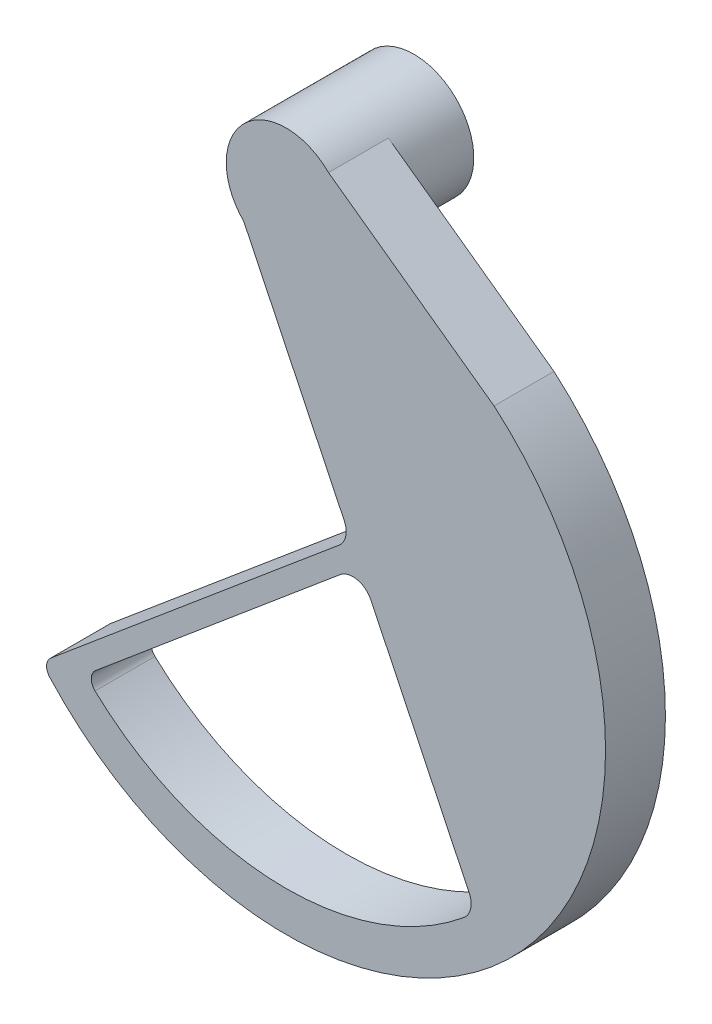
ISO-10303-21;
HEADER;
FILE_DESCRIPTION(('STEP AP214'),'2;1');
FILE_NAME('part.step','',(''),(''),'','','');
FILE_SCHEMA(('AUTOMOTIVE_DESIGN { 1 0 10303 214 1 1 1 1 }'));
ENDSEC;
DATA;
#1=APPLICATION_CONTEXT('core data for automotive mechanical design processes');
#2=APPLICATION_PROTOCOL_DEFINITION('international standard','automotive_design',2000,#1);
#3=PRODUCT_CONTEXT('',#1,'mechanical');
#4=PRODUCT('Part','Part','',(#3));
#5=PRODUCT_RELATED_PRODUCT_CATEGORY('part','',(#4));
#6=PRODUCT_DEFINITION_FORMATION('','',#4);
#7=PRODUCT_DEFINITION_CONTEXT('part definition',#1,'design');
#8=PRODUCT_DEFINITION('design','',#6,#7);
#9=PRODUCT_DEFINITION_SHAPE('','',#8);
#10=(LENGTH_UNIT() NAMED_UNIT(*) SI_UNIT(.MILLI.,.METRE.));
#11=(NAMED_UNIT(*) PLANE_ANGLE_UNIT() SI_UNIT($,.RADIAN.));
#12=(NAMED_UNIT(*) SI_UNIT($,.STERADIAN.) SOLID_ANGLE_UNIT());
#13=UNCERTAINTY_MEASURE_WITH_UNIT(LENGTH_MEASURE(1.E-05),#10,'distance_accuracy_value','');
#14=(GEOMETRIC_REPRESENTATION_CONTEXT(3) GLOBAL_UNCERTAINTY_ASSIGNED_CONTEXT((#13)) GLOBAL_UNIT_ASSIGNED_CONTEXT((#10,
#11,#12)) REPRESENTATION_CONTEXT('',''));
#15=CARTESIAN_POINT('',(0.,0.,0.));
#16=DIRECTION('',(0.,0.,1.));
#17=DIRECTION('',(1.,0.,0.));
#18=AXIS2_PLACEMENT_3D('',#15,#16,#17);
#19=CARTESIAN_POINT('',(0.,0.,0.));
#20=DIRECTION('',(0.,0.,1.));
#21=DIRECTION('',(1.,0.,0.));
#22=AXIS2_PLACEMENT_3D('',#19,#20,#21);
#23=PLANE('',#22);
#24=DIRECTION('',(0.433389731511241,-0.901206602628173,0.));
#25=VECTOR('',#24,1.);
#26=CARTESIAN_POINT('',(-12.7570586950624,-6.1348621133076,0.));
#27=LINE('',#26,#25);
#28=CARTESIAN_POINT('',(21.2324006956412,-76.8137984043253,0.));
#29=VERTEX_POINT('',#28);
#30=CARTESIAN_POINT('',(45.844843506453,-127.9938203457,0.));
#31=VERTEX_POINT('',#30);
#32=EDGE_CURVE('E182',#29,#31,#27,.T.);
#33=ORIENTED_EDGE('',*,*,#32,.F.);
#34=CARTESIAN_POINT('',(16.7263676825004,-78.9807470618814,0.));
#35=DIRECTION('',(0.,0.,1.));
#36=DIRECTION('',(1.,0.,0.));
#37=AXIS2_PLACEMENT_3D('',#34,#35,#36);
#38=CIRCLE('',#37,5.);
#39=CARTESIAN_POINT('',(13.5112294647628,-75.1515322284145,0.));
#40=VERTEX_POINT('',#39);
#41=EDGE_CURVE('E106',#40,#29,#38,.F.);
#42=ORIENTED_EDGE('',*,*,#41,.F.);
#43=DIRECTION('',(0.765842966693394,0.643027643547508,0.));
#44=VECTOR('',#43,1.);
#45=CARTESIAN_POINT('',(42.5956727933285,-50.7312504333006,0.));
#46=LINE('',#45,#44);
#47=CARTESIAN_POINT('',(-47.7476784165524,-126.586582094174,0.));
#48=VERTEX_POINT('',#47);
#49=EDGE_CURVE('E100',#48,#40,#46,.T.);
#50=ORIENTED_EDGE('',*,*,#49,.F.);
#51=CARTESIAN_POINT('',(-45.8185954859101,-128.884110994254,0.));
#52=DIRECTION('',(0.,0.,1.));
#53=DIRECTION('',(1.,0.,0.));
#54=AXIS2_PLACEMENT_3D('',#51,#52,#53);
#55=CIRCLE('',#54,2.99999999999979);
#56=CARTESIAN_POINT('',(-47.870174388264,-131.072951785042,0.));
#57=VERTEX_POINT('',#56);
#58=EDGE_CURVE('E158',#57,#48,#55,.F.);
#59=ORIENTED_EDGE('',*,*,#58,.F.);
#60=CARTESIAN_POINT('',(0.,-80.,0.));
#61=DIRECTION('',(0.,0.,1.));
#62=DIRECTION('',(1.,0.,0.));
#63=AXIS2_PLACEMENT_3D('',#60,#61,#62);
#64=CIRCLE('',#63,70.);
#65=CARTESIAN_POINT('',(44.5187189927976,-134.019289695814,0.));
#66=VERTEX_POINT('',#65);
#67=EDGE_CURVE('E189',#57,#66,#64,.T.);
#68=ORIENTED_EDGE('',*,*,#67,.T.);
#69=CARTESIAN_POINT('',(41.3388104933121,-130.160769003256,0.));
#70=DIRECTION('',(0.,0.,1.));
#71=DIRECTION('',(1.,0.,0.));
#72=AXIS2_PLACEMENT_3D('',#69,#70,#71);
#73=CIRCLE('',#72,4.99999999999999);
#74=EDGE_CURVE('E185',#31,#66,#73,.F.);
#75=ORIENTED_EDGE('',*,*,#74,.F.);
#76=EDGE_LOOP('',(#33,#42,#50,#59,#68,#75));
#77=FACE_BOUND('',#76,.T.);
#78=CARTESIAN_POINT('',(0.,0.,0.));
#79=DIRECTION('',(0.,0.,-1.));
#80=DIRECTION('',(-1.,0.,0.));
#81=AXIS2_PLACEMENT_3D('',#78,#79,#80);
#82=CIRCLE('',#81,15.);
#83=CARTESIAN_POINT('',(10.6066017177981,10.6066017177983,0.));
#84=VERTEX_POINT('',#83);
#85=CARTESIAN_POINT('',(-10.6066017177981,-10.6066017177983,0.));
#86=VERTEX_POINT('',#85);
#87=EDGE_CURVE('E215',#84,#86,#82,.T.);
#88=ORIENTED_EDGE('',*,*,#87,.F.);
#89=DIRECTION('',(0.811357931424902,-0.584549661802916,0.));
#90=VECTOR('',#89,1.);
#91=CARTESIAN_POINT('',(8.65474635415258,12.0128323695447,0.));
#92=LINE('',#91,#90);
#93=CARTESIAN_POINT('',(52.0761789176771,-19.2705047828151,0.));
#94=VERTEX_POINT('',#93);
#95=EDGE_CURVE('E181',#84,#94,#92,.T.);
#96=ORIENTED_EDGE('',*,*,#95,.T.);
#97=CARTESIAN_POINT('',(0.,-80.,0.));
#98=DIRECTION('',(0.,0.,1.));
#99=DIRECTION('',(1.,0.,0.));
#100=AXIS2_PLACEMENT_3D('',#97,#98,#99);
#101=CIRCLE('',#100,80.);
#102=CARTESIAN_POINT('',(-59.2335308651964,-133.771635843089,0.));
#103=VERTEX_POINT('',#102);
#104=EDGE_CURVE('E178',#103,#94,#101,.T.);
#105=ORIENTED_EDGE('',*,*,#104,.F.);
#106=CARTESIAN_POINT('',(-57.0122734577518,-131.755199498973,0.));
#107=DIRECTION('',(0.,0.,1.));
#108=DIRECTION('',(1.,0.,0.));
#109=AXIS2_PLACEMENT_3D('',#106,#107,#108);
#110=CIRCLE('',#109,2.99999999999976);
#111=CARTESIAN_POINT('',(-58.9406362868111,-129.457066169617,0.));
#112=VERTEX_POINT('',#111);
#113=EDGE_CURVE('E175',#103,#112,#110,.F.);
#114=ORIENTED_EDGE('',*,*,#113,.T.);
#115=DIRECTION('',(0.766044443118982,0.642787609686534,0.));
#116=VECTOR('',#115,1.);
#117=CARTESIAN_POINT('',(39.3923101204882,-46.9459271066778,0.));
#118=LINE('',#117,#116);
#119=CARTESIAN_POINT('',(13.2441851892925,-68.8868090924212,0.));
#120=VERTEX_POINT('',#119);
#121=EDGE_CURVE('E171',#112,#120,#118,.T.);
#122=ORIENTED_EDGE('',*,*,#121,.T.);
#123=CARTESIAN_POINT('',(10.0302471408598,-65.0565868768263,0.));
#124=DIRECTION('',(0.,0.,1.));
#125=DIRECTION('',(1.,0.,0.));
#126=AXIS2_PLACEMENT_3D('',#123,#124,#125);
#127=CIRCLE('',#126,5.);
#128=CARTESIAN_POINT('',(14.5362801540007,-62.8896382192701,0.));
#129=VERTEX_POINT('',#128);
#130=EDGE_CURVE('E168',#120,#129,#127,.T.);
#131=ORIENTED_EDGE('',*,*,#130,.T.);
#132=DIRECTION('',(0.433389731511242,-0.901206602628173,0.));
#133=VECTOR('',#132,1.);
#134=CARTESIAN_POINT('',(-12.7570586950624,-6.13486211330761,0.));
#135=LINE('',#134,#133);
#136=EDGE_CURVE('E186',#86,#129,#135,.T.);
#137=ORIENTED_EDGE('',*,*,#136,.F.);
#138=EDGE_LOOP('',(#88,#96,#105,#114,#122,#131,#137));
#139=FACE_BOUND('',#138,.T.);
#140=ADVANCED_FACE('F39',(#77,#139),#23,.F.);
#141=CARTESIAN_POINT('',(-12.7570586950624,-6.1348621133076,15.));
#142=DIRECTION('',(0.901206602628173,0.433389731511241,0.));
#143=DIRECTION('',(-0.433389731511241,0.901206602628173,0.));
#144=AXIS2_PLACEMENT_3D('',#141,#142,#143);
#145=PLANE('',#144);
#146=ORIENTED_EDGE('',*,*,#32,.T.);
#147=DIRECTION('',(0.,0.,-1.));
#148=VECTOR('',#147,1.);
#149=CARTESIAN_POINT('',(45.844843506453,-127.9938203457,15.));
#150=LINE('',#149,#148);
#151=CARTESIAN_POINT('',(45.844843506453,-127.9938203457,15.));
#152=VERTEX_POINT('',#151);
#153=EDGE_CURVE('E11',#152,#31,#150,.T.);
#154=ORIENTED_EDGE('',*,*,#153,.F.);
#155=DIRECTION('',(0.433389731511241,-0.901206602628173,0.));
#156=VECTOR('',#155,1.);
#157=CARTESIAN_POINT('',(-12.7570586950624,-6.1348621133076,15.));
#158=LINE('',#157,#156);
#159=CARTESIAN_POINT('',(21.2324006956412,-76.8137984043253,15.));
#160=VERTEX_POINT('',#159);
#161=EDGE_CURVE('E236',#160,#152,#158,.T.);
#162=ORIENTED_EDGE('',*,*,#161,.F.);
#163=DIRECTION('',(0.,0.,-1.));
#164=VECTOR('',#163,1.);
#165=CARTESIAN_POINT('',(21.2324006956412,-76.8137984043253,15.));
#166=LINE('',#165,#164);
#167=EDGE_CURVE('E196',#160,#29,#166,.T.);
#168=ORIENTED_EDGE('',*,*,#167,.T.);
#169=EDGE_LOOP('',(#146,#154,#162,#168));
#170=FACE_BOUND('',#169,.T.);
#171=ADVANCED_FACE('F248',(#170),#145,.F.);
#172=CARTESIAN_POINT('',(41.3388104933121,-130.160769003256,15.));
#173=DIRECTION('',(0.,0.,-1.));
#174=DIRECTION('',(-1.,0.,0.));
#175=AXIS2_PLACEMENT_3D('',#172,#173,#174);
#176=CYLINDRICAL_SURFACE('',#175,4.99999999999999);
#177=ORIENTED_EDGE('',*,*,#74,.T.);
#178=DIRECTION('',(0.,0.,-1.));
#179=VECTOR('',#178,1.);
#180=CARTESIAN_POINT('',(44.5187189927976,-134.019289695814,15.));
#181=LINE('',#180,#179);
#182=CARTESIAN_POINT('',(44.5187189927976,-134.019289695814,15.));
#183=VERTEX_POINT('',#182);
#184=EDGE_CURVE('E49',#183,#66,#181,.T.);
#185=ORIENTED_EDGE('',*,*,#184,.F.);
#186=CARTESIAN_POINT('',(41.3388104933121,-130.160769003256,15.));
#187=DIRECTION('',(0.,0.,1.));
#188=DIRECTION('',(1.,0.,0.));
#189=AXIS2_PLACEMENT_3D('',#186,#187,#188);
#190=CIRCLE('',#189,4.99999999999999);
#191=EDGE_CURVE('E238',#152,#183,#190,.F.);
#192=ORIENTED_EDGE('',*,*,#191,.F.);
#193=ORIENTED_EDGE('',*,*,#153,.T.);
#194=EDGE_LOOP('',(#177,#185,#192,#193));
#195=FACE_BOUND('',#194,.T.);
#196=ADVANCED_FACE('F270',(#195),#176,.F.);
#197=CARTESIAN_POINT('',(0.,-80.,15.));
#198=DIRECTION('',(0.,0.,-1.));
#199=DIRECTION('',(-1.,0.,0.));
#200=AXIS2_PLACEMENT_3D('',#197,#198,#199);
#201=CYLINDRICAL_SURFACE('',#200,70.);
#202=ORIENTED_EDGE('',*,*,#67,.F.);
#203=DIRECTION('',(0.,0.,-1.));
#204=VECTOR('',#203,1.);
#205=CARTESIAN_POINT('',(-47.870174388264,-131.072951785042,15.));
#206=LINE('',#205,#204);
#207=CARTESIAN_POINT('',(-47.870174388264,-131.072951785042,15.));
#208=VERTEX_POINT('',#207);
#209=EDGE_CURVE('E159',#208,#57,#206,.T.);
#210=ORIENTED_EDGE('',*,*,#209,.F.);
#211=CARTESIAN_POINT('',(0.,-80.,15.));
#212=DIRECTION('',(0.,0.,1.));
#213=DIRECTION('',(1.,0.,0.));
#214=AXIS2_PLACEMENT_3D('',#211,#212,#213);
#215=CIRCLE('',#214,70.);
#216=EDGE_CURVE('E152',#208,#183,#215,.T.);
#217=ORIENTED_EDGE('',*,*,#216,.T.);
#218=ORIENTED_EDGE('',*,*,#184,.T.);
#219=EDGE_LOOP('',(#202,#210,#217,#218));
#220=FACE_BOUND('',#219,.T.);
#221=ADVANCED_FACE('F241',(#220),#201,.F.);
#222=CARTESIAN_POINT('',(-45.8185954859101,-128.884110994254,15.));
#223=DIRECTION('',(0.,0.,-1.));
#224=DIRECTION('',(-1.,0.,0.));
#225=AXIS2_PLACEMENT_3D('',#222,#223,#224);
#226=CYLINDRICAL_SURFACE('',#225,2.99999999999979);
#227=ORIENTED_EDGE('',*,*,#58,.T.);
#228=DIRECTION('',(0.,0.,-1.));
#229=VECTOR('',#228,1.);
#230=CARTESIAN_POINT('',(-47.7476784165524,-126.586582094174,15.));
#231=LINE('',#230,#229);
#232=CARTESIAN_POINT('',(-47.7476784165524,-126.586582094174,15.));
#233=VERTEX_POINT('',#232);
#234=EDGE_CURVE('E155',#233,#48,#231,.T.);
#235=ORIENTED_EDGE('',*,*,#234,.F.);
#236=CARTESIAN_POINT('',(-45.8185954859101,-128.884110994254,15.));
#237=DIRECTION('',(0.,0.,1.));
#238=DIRECTION('',(1.,0.,0.));
#239=AXIS2_PLACEMENT_3D('',#236,#237,#238);
#240=CIRCLE('',#239,2.99999999999979);
#241=EDGE_CURVE('E146',#208,#233,#240,.F.);
#242=ORIENTED_EDGE('',*,*,#241,.F.);
#243=ORIENTED_EDGE('',*,*,#209,.T.);
#244=EDGE_LOOP('',(#227,#235,#242,#243));
#245=FACE_BOUND('',#244,.T.);
#246=ADVANCED_FACE('F156',(#245),#226,.F.);
#247=CARTESIAN_POINT('',(42.5956727933285,-50.7312504333006,15.));
#248=DIRECTION('',(-0.643027643547508,0.765842966693394,0.));
#249=DIRECTION('',(-0.765842966693394,-0.643027643547508,0.));
#250=AXIS2_PLACEMENT_3D('',#247,#248,#249);
#251=PLANE('',#250);
#252=ORIENTED_EDGE('',*,*,#49,.T.);
#253=DIRECTION('',(0.,0.,-1.));
#254=VECTOR('',#253,1.);
#255=CARTESIAN_POINT('',(13.5112294647628,-75.1515322284145,15.));
#256=LINE('',#255,#254);
#257=CARTESIAN_POINT('',(13.5112294647628,-75.1515322284145,15.));
#258=VERTEX_POINT('',#257);
#259=EDGE_CURVE('E160',#258,#40,#256,.T.);
#260=ORIENTED_EDGE('',*,*,#259,.F.);
#261=DIRECTION('',(0.765842966693394,0.643027643547508,0.));
#262=VECTOR('',#261,1.);
#263=CARTESIAN_POINT('',(42.5956727933285,-50.7312504333006,15.));
#264=LINE('',#263,#262);
#265=EDGE_CURVE('E150',#233,#258,#264,.T.);
#266=ORIENTED_EDGE('',*,*,#265,.F.);
#267=ORIENTED_EDGE('',*,*,#234,.T.);
#268=EDGE_LOOP('',(#252,#260,#266,#267));
#269=FACE_BOUND('',#268,.T.);
#270=ADVANCED_FACE('F162',(#269),#251,.F.);
#271=CARTESIAN_POINT('',(10.0302471408598,-65.0565868768263,15.));
#272=DIRECTION('',(0.,0.,-1.));
#273=DIRECTION('',(-1.,0.,0.));
#274=AXIS2_PLACEMENT_3D('',#271,#272,#273);
#275=CYLINDRICAL_SURFACE('',#274,5.);
#276=ORIENTED_EDGE('',*,*,#130,.F.);
#277=DIRECTION('',(0.,0.,-1.));
#278=VECTOR('',#277,1.);
#279=CARTESIAN_POINT('',(13.2441851892925,-68.8868090924212,15.));
#280=LINE('',#279,#278);
#281=CARTESIAN_POINT('',(13.2441851892925,-68.8868090924212,15.));
#282=VERTEX_POINT('',#281);
#283=EDGE_CURVE('E114',#282,#120,#280,.T.);
#284=ORIENTED_EDGE('',*,*,#283,.F.);
#285=CARTESIAN_POINT('',(10.0302471408598,-65.0565868768263,15.));
#286=DIRECTION('',(0.,0.,1.));
#287=DIRECTION('',(1.,0.,0.));
#288=AXIS2_PLACEMENT_3D('',#285,#286,#287);
#289=CIRCLE('',#288,5.);
#290=CARTESIAN_POINT('',(14.5362801540007,-62.8896382192701,15.));
#291=VERTEX_POINT('',#290);
#292=EDGE_CURVE('E195',#282,#291,#289,.T.);
#293=ORIENTED_EDGE('',*,*,#292,.T.);
#294=DIRECTION('',(0.,0.,-1.));
#295=VECTOR('',#294,1.);
#296=CARTESIAN_POINT('',(14.5362801540007,-62.8896382192701,15.));
#297=LINE('',#296,#295);
#298=EDGE_CURVE('E164',#291,#129,#297,.T.);
#299=ORIENTED_EDGE('',*,*,#298,.T.);
#300=EDGE_LOOP('',(#276,#284,#293,#299));
#301=FACE_BOUND('',#300,.T.);
#302=ADVANCED_FACE('F41',(#301),#275,.F.);
#303=CARTESIAN_POINT('',(39.3923101204882,-46.9459271066778,15.));
#304=DIRECTION('',(-0.642787609686534,0.766044443118983,0.));
#305=DIRECTION('',(-0.766044443118982,-0.642787609686534,0.));
#306=AXIS2_PLACEMENT_3D('',#303,#304,#305);
#307=PLANE('',#306);
#308=ORIENTED_EDGE('',*,*,#121,.F.);
#309=DIRECTION('',(0.,0.,-1.));
#310=VECTOR('',#309,1.);
#311=CARTESIAN_POINT('',(-58.9406362868111,-129.457066169617,15.));
#312=LINE('',#311,#310);
#313=CARTESIAN_POINT('',(-58.9406362868111,-129.457066169617,15.));
#314=VERTEX_POINT('',#313);
#315=EDGE_CURVE('E208',#314,#112,#312,.T.);
#316=ORIENTED_EDGE('',*,*,#315,.F.);
#317=DIRECTION('',(0.766044443118982,0.642787609686534,0.));
#318=VECTOR('',#317,1.);
#319=CARTESIAN_POINT('',(39.3923101204882,-46.9459271066778,15.));
#320=LINE('',#319,#318);
#321=EDGE_CURVE('E221',#314,#282,#320,.T.);
#322=ORIENTED_EDGE('',*,*,#321,.T.);
#323=ORIENTED_EDGE('',*,*,#283,.T.);
#324=EDGE_LOOP('',(#308,#316,#322,#323));
#325=FACE_BOUND('',#324,.T.);
#326=ADVANCED_FACE('F313',(#325),#307,.T.);
#327=CARTESIAN_POINT('',(-57.0122734577518,-131.755199498973,15.));
#328=DIRECTION('',(0.,0.,-1.));
#329=DIRECTION('',(-1.,0.,0.));
#330=AXIS2_PLACEMENT_3D('',#327,#328,#329);
#331=CYLINDRICAL_SURFACE('',#330,2.99999999999976);
#332=ORIENTED_EDGE('',*,*,#113,.F.);
#333=DIRECTION('',(0.,0.,-1.));
#334=VECTOR('',#333,1.);
#335=CARTESIAN_POINT('',(-59.2335308651964,-133.771635843089,15.));
#336=LINE('',#335,#334);
#337=CARTESIAN_POINT('',(-59.2335308651964,-133.771635843089,15.));
#338=VERTEX_POINT('',#337);
#339=EDGE_CURVE('E205',#338,#103,#336,.T.);
#340=ORIENTED_EDGE('',*,*,#339,.F.);
#341=CARTESIAN_POINT('',(-57.0122734577518,-131.755199498973,15.));
#342=DIRECTION('',(0.,0.,1.));
#343=DIRECTION('',(1.,0.,0.));
#344=AXIS2_PLACEMENT_3D('',#341,#342,#343);
#345=CIRCLE('',#344,2.99999999999976);
#346=EDGE_CURVE('E224',#338,#314,#345,.F.);
#347=ORIENTED_EDGE('',*,*,#346,.T.);
#348=ORIENTED_EDGE('',*,*,#315,.T.);
#349=EDGE_LOOP('',(#332,#340,#347,#348));
#350=FACE_BOUND('',#349,.T.);
#351=ADVANCED_FACE('F310',(#350),#331,.T.);
#352=CARTESIAN_POINT('',(0.,-80.,15.));
#353=DIRECTION('',(0.,0.,-1.));
#354=DIRECTION('',(-1.,0.,0.));
#355=AXIS2_PLACEMENT_3D('',#352,#353,#354);
#356=CYLINDRICAL_SURFACE('',#355,80.);
#357=ORIENTED_EDGE('',*,*,#104,.T.);
#358=DIRECTION('',(0.,0.,-1.));
#359=VECTOR('',#358,1.);
#360=CARTESIAN_POINT('',(52.0761789176771,-19.2705047828151,15.));
#361=LINE('',#360,#359);
#362=CARTESIAN_POINT('',(52.0761789176771,-19.2705047828151,15.));
#363=VERTEX_POINT('',#362);
#364=EDGE_CURVE('E203',#363,#94,#361,.T.);
#365=ORIENTED_EDGE('',*,*,#364,.F.);
#366=CARTESIAN_POINT('',(0.,-80.,15.));
#367=DIRECTION('',(0.,0.,1.));
#368=DIRECTION('',(1.,0.,0.));
#369=AXIS2_PLACEMENT_3D('',#366,#367,#368);
#370=CIRCLE('',#369,80.);
#371=EDGE_CURVE('E227',#338,#363,#370,.T.);
#372=ORIENTED_EDGE('',*,*,#371,.F.);
#373=ORIENTED_EDGE('',*,*,#339,.T.);
#374=EDGE_LOOP('',(#357,#365,#372,#373));
#375=FACE_BOUND('',#374,.T.);
#376=ADVANCED_FACE('F303',(#375),#356,.T.);
#377=CARTESIAN_POINT('',(8.65474635415258,12.0128323695447,15.));
#378=DIRECTION('',(0.584549661802916,0.811357931424902,0.));
#379=DIRECTION('',(-0.811357931424902,0.584549661802916,0.));
#380=AXIS2_PLACEMENT_3D('',#377,#378,#379);
#381=PLANE('',#380);
#382=ORIENTED_EDGE('',*,*,#95,.F.);
#383=DIRECTION('',(0.,0.,-1.));
#384=VECTOR('',#383,1.);
#385=CARTESIAN_POINT('',(10.6066017177981,10.6066017177983,15.));
#386=LINE('',#385,#384);
#387=CARTESIAN_POINT('',(10.6066017177981,10.6066017177983,15.));
#388=VERTEX_POINT('',#387);
#389=EDGE_CURVE('E206',#388,#84,#386,.T.);
#390=ORIENTED_EDGE('',*,*,#389,.F.);
#391=DIRECTION('',(0.811357931424902,-0.584549661802916,0.));
#392=VECTOR('',#391,1.);
#393=CARTESIAN_POINT('',(8.65474635415258,12.0128323695447,15.));
#394=LINE('',#393,#392);
#395=EDGE_CURVE('E229',#388,#363,#394,.T.);
#396=ORIENTED_EDGE('',*,*,#395,.T.);
#397=ORIENTED_EDGE('',*,*,#364,.T.);
#398=EDGE_LOOP('',(#382,#390,#396,#397));
#399=FACE_BOUND('',#398,.T.);
#400=ADVANCED_FACE('F297',(#399),#381,.T.);
#401=CARTESIAN_POINT('',(0.,0.,15.));
#402=DIRECTION('',(0.,0.,-1.));
#403=DIRECTION('',(-1.,0.,0.));
#404=AXIS2_PLACEMENT_3D('',#401,#402,#403);
#405=CYLINDRICAL_SURFACE('',#404,15.);
#406=ORIENTED_EDGE('',*,*,#389,.T.);
#407=ORIENTED_EDGE('',*,*,#87,.T.);
#408=DIRECTION('',(0.,0.,-1.));
#409=VECTOR('',#408,1.);
#410=CARTESIAN_POINT('',(-10.6066017177981,-10.6066017177983,15.));
#411=LINE('',#410,#409);
#412=CARTESIAN_POINT('',(-10.6066017177981,-10.6066017177983,15.));
#413=VERTEX_POINT('',#412);
#414=EDGE_CURVE('E202',#413,#86,#411,.T.);
#415=ORIENTED_EDGE('',*,*,#414,.F.);
#416=CARTESIAN_POINT('',(0.,0.,15.));
#417=DIRECTION('',(0.,0.,1.));
#418=DIRECTION('',(1.,0.,0.));
#419=AXIS2_PLACEMENT_3D('',#416,#417,#418);
#420=CIRCLE('',#419,15.);
#421=EDGE_CURVE('E232',#388,#413,#420,.T.);
#422=ORIENTED_EDGE('',*,*,#421,.F.);
#423=EDGE_LOOP('',(#406,#407,#415,#422));
#424=FACE_BOUND('',#423,.T.);
#425=CARTESIAN_POINT('',(0.,0.,-17.));
#426=DIRECTION('',(0.,0.,-1.));
#427=DIRECTION('',(-1.,0.,0.));
#428=AXIS2_PLACEMENT_3D('',#425,#426,#427);
#429=CIRCLE('',#428,15.);
#430=CARTESIAN_POINT('',(-15.,0.,-17.));
#431=VERTEX_POINT('',#430);
#432=EDGE_CURVE('E172',#431,#431,#429,.T.);
#433=ORIENTED_EDGE('',*,*,#432,.F.);
#434=EDGE_LOOP('',(#433));
#435=FACE_BOUND('',#434,.T.);
#436=ADVANCED_FACE('F261',(#424,#435),#405,.T.);
#437=CARTESIAN_POINT('',(-12.7570586950624,-6.13486211330761,15.));
#438=DIRECTION('',(0.901206602628173,0.433389731511242,0.));
#439=DIRECTION('',(-0.433389731511242,0.901206602628173,0.));
#440=AXIS2_PLACEMENT_3D('',#437,#438,#439);
#441=PLANE('',#440);
#442=ORIENTED_EDGE('',*,*,#136,.T.);
#443=ORIENTED_EDGE('',*,*,#298,.F.);
#444=DIRECTION('',(0.433389731511242,-0.901206602628173,0.));
#445=VECTOR('',#444,1.);
#446=CARTESIAN_POINT('',(-12.7570586950624,-6.13486211330761,15.));
#447=LINE('',#446,#445);
#448=EDGE_CURVE('E234',#413,#291,#447,.T.);
#449=ORIENTED_EDGE('',*,*,#448,.F.);
#450=ORIENTED_EDGE('',*,*,#414,.T.);
#451=EDGE_LOOP('',(#442,#443,#449,#450));
#452=FACE_BOUND('',#451,.T.);
#453=ADVANCED_FACE('F252',(#452),#441,.F.);
#454=CARTESIAN_POINT('',(16.7263676825004,-78.9807470618814,15.));
#455=DIRECTION('',(0.,0.,-1.));
#456=DIRECTION('',(-1.,0.,0.));
#457=AXIS2_PLACEMENT_3D('',#454,#455,#456);
#458=CYLINDRICAL_SURFACE('',#457,5.);
#459=ORIENTED_EDGE('',*,*,#41,.T.);
#460=ORIENTED_EDGE('',*,*,#167,.F.);
#461=CARTESIAN_POINT('',(16.7263676825004,-78.9807470618814,15.));
#462=DIRECTION('',(0.,0.,1.));
#463=DIRECTION('',(1.,0.,0.));
#464=AXIS2_PLACEMENT_3D('',#461,#462,#463);
#465=CIRCLE('',#464,5.);
#466=EDGE_CURVE('E58',#258,#160,#465,.F.);
#467=ORIENTED_EDGE('',*,*,#466,.F.);
#468=ORIENTED_EDGE('',*,*,#259,.T.);
#469=EDGE_LOOP('',(#459,#460,#467,#468));
#470=FACE_BOUND('',#469,.T.);
#471=ADVANCED_FACE('F250',(#470),#458,.F.);
#472=CARTESIAN_POINT('',(0.,0.,15.));
#473=DIRECTION('',(0.,0.,1.));
#474=DIRECTION('',(1.,0.,0.));
#475=AXIS2_PLACEMENT_3D('',#472,#473,#474);
#476=PLANE('',#475);
#477=ORIENTED_EDGE('',*,*,#292,.F.);
#478=ORIENTED_EDGE('',*,*,#321,.F.);
#479=ORIENTED_EDGE('',*,*,#346,.F.);
#480=ORIENTED_EDGE('',*,*,#371,.T.);
#481=ORIENTED_EDGE('',*,*,#395,.F.);
#482=ORIENTED_EDGE('',*,*,#421,.T.);
#483=ORIENTED_EDGE('',*,*,#448,.T.);
#484=EDGE_LOOP('',(#477,#478,#479,#480,#481,#482,#483));
#485=FACE_BOUND('',#484,.T.);
#486=ORIENTED_EDGE('',*,*,#161,.T.);
#487=ORIENTED_EDGE('',*,*,#191,.T.);
#488=ORIENTED_EDGE('',*,*,#216,.F.);
#489=ORIENTED_EDGE('',*,*,#241,.T.);
#490=ORIENTED_EDGE('',*,*,#265,.T.);
#491=ORIENTED_EDGE('',*,*,#466,.T.);
#492=EDGE_LOOP('',(#486,#487,#488,#489,#490,#491));
#493=FACE_BOUND('',#492,.T.);
#494=ADVANCED_FACE('F148',(#485,#493),#476,.T.);
#495=CARTESIAN_POINT('',(0.,0.,-17.));
#496=DIRECTION('',(0.,0.,-1.));
#497=DIRECTION('',(-1.,0.,0.));
#498=AXIS2_PLACEMENT_3D('',#495,#496,#497);
#499=PLANE('',#498);
#500=CARTESIAN_POINT('',(0.,0.,-17.));
#501=DIRECTION('',(0.,0.,-1.));
#502=DIRECTION('',(-1.,0.,0.));
#503=AXIS2_PLACEMENT_3D('',#500,#501,#502);
#504=CIRCLE('',#503,10.1);
#505=CARTESIAN_POINT('',(-10.1,0.,-17.));
#506=VERTEX_POINT('',#505);
#507=EDGE_CURVE('E287',#506,#506,#504,.T.);
#508=ORIENTED_EDGE('',*,*,#507,.F.);
#509=EDGE_LOOP('',(#508));
#510=FACE_BOUND('',#509,.T.);
#511=ORIENTED_EDGE('',*,*,#432,.T.);
#512=EDGE_LOOP('',(#511));
#513=FACE_BOUND('',#512,.T.);
#514=ADVANCED_FACE('F258',(#510,#513),#499,.T.);
#515=CARTESIAN_POINT('',(0.,0.,-15.));
#516=DIRECTION('',(0.,0.,-1.));
#517=DIRECTION('',(-1.,0.,0.));
#518=AXIS2_PLACEMENT_3D('',#515,#516,#517);
#519=CYLINDRICAL_SURFACE('',#518,10.1);
#520=CARTESIAN_POINT('',(0.,0.,-15.));
#521=DIRECTION('',(0.,0.,-1.));
#522=DIRECTION('',(-1.,0.,0.));
#523=AXIS2_PLACEMENT_3D('',#520,#521,#522);
#524=CIRCLE('',#523,10.1);
#525=CARTESIAN_POINT('',(-10.1,0.,-15.));
#526=VERTEX_POINT('',#525);
#527=EDGE_CURVE('E218',#526,#526,#524,.T.);
#528=ORIENTED_EDGE('',*,*,#527,.F.);
#529=EDGE_LOOP('',(#528));
#530=FACE_BOUND('',#529,.T.);
#531=ORIENTED_EDGE('',*,*,#507,.T.);
#532=EDGE_LOOP('',(#531));
#533=FACE_BOUND('',#532,.T.);
#534=ADVANCED_FACE('F275',(#530,#533),#519,.F.);
#535=CARTESIAN_POINT('',(0.,0.,-15.));
#536=DIRECTION('',(0.,0.,-1.));
#537=DIRECTION('',(-1.,0.,0.));
#538=AXIS2_PLACEMENT_3D('',#535,#536,#537);
#539=PLANE('',#538);
#540=ORIENTED_EDGE('',*,*,#527,.T.);
#541=EDGE_LOOP('',(#540));
#542=FACE_BOUND('',#541,.T.);
#543=ADVANCED_FACE('F279',(#542),#539,.T.);
#544=CLOSED_SHELL('',(#140,#171,#196,#221,#246,#270,#302,#326,#351,#376,#400,#436,#453,#471,
#494,#514,#534,#543));
#545=MANIFOLD_SOLID_BREP('B2',#544);
#546=ADVANCED_BREP_SHAPE_REPRESENTATION('',(#18,#545),#14);
#547=SHAPE_DEFINITION_REPRESENTATION(#9,#546);
ENDSEC;
END-ISO-10303-21;
